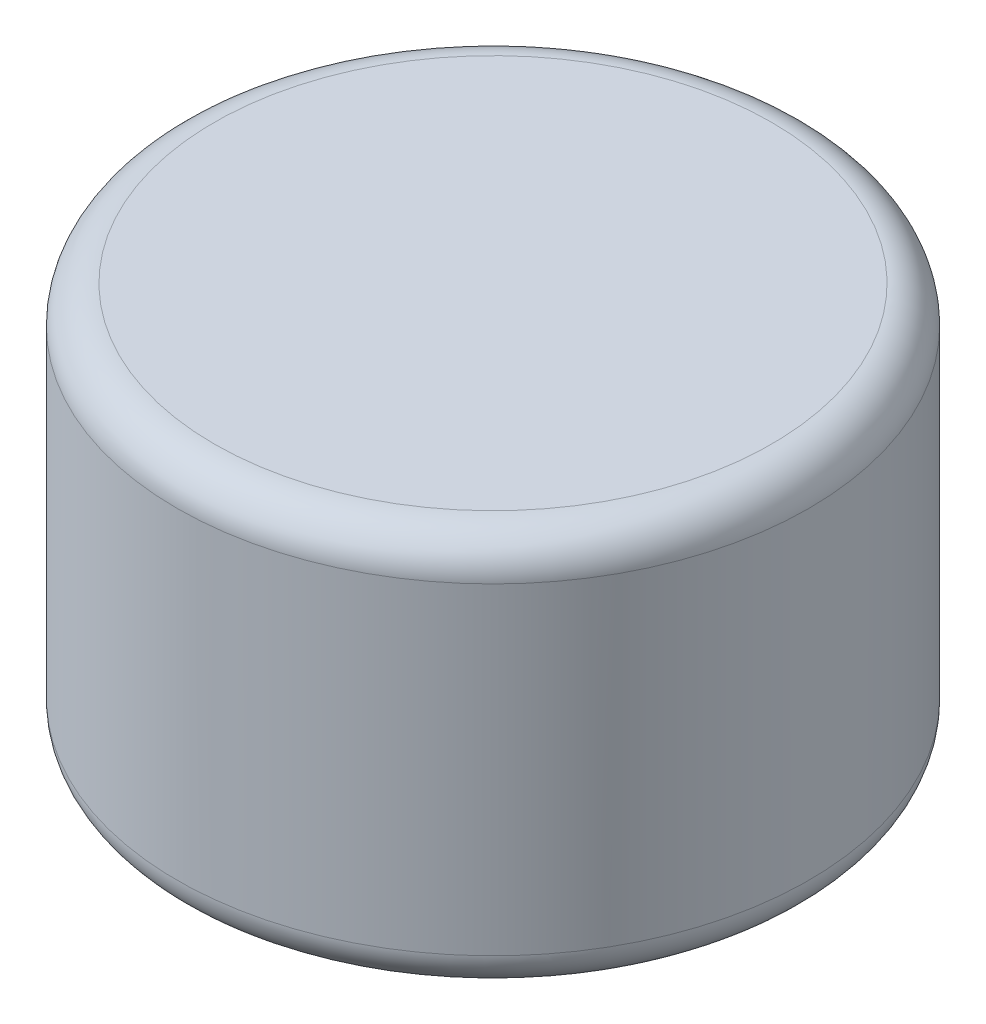
ISO-10303-21;
HEADER;
FILE_DESCRIPTION(('STEP AP214'),'2;1');
FILE_NAME('part.step','',(''),(''),'','','');
FILE_SCHEMA(('AUTOMOTIVE_DESIGN { 1 0 10303 214 1 1 1 1 }'));
ENDSEC;
DATA;
#1=APPLICATION_CONTEXT('core data for automotive mechanical design processes');
#2=APPLICATION_PROTOCOL_DEFINITION('international standard','automotive_design',2000,#1);
#3=PRODUCT_CONTEXT('',#1,'mechanical');
#4=PRODUCT('Part','Part','',(#3));
#5=PRODUCT_RELATED_PRODUCT_CATEGORY('part','',(#4));
#6=PRODUCT_DEFINITION_FORMATION('','',#4);
#7=PRODUCT_DEFINITION_CONTEXT('part definition',#1,'design');
#8=PRODUCT_DEFINITION('design','',#6,#7);
#9=PRODUCT_DEFINITION_SHAPE('','',#8);
#10=(LENGTH_UNIT() NAMED_UNIT(*) SI_UNIT(.MILLI.,.METRE.));
#11=(NAMED_UNIT(*) PLANE_ANGLE_UNIT() SI_UNIT($,.RADIAN.));
#12=(NAMED_UNIT(*) SI_UNIT($,.STERADIAN.) SOLID_ANGLE_UNIT());
#13=UNCERTAINTY_MEASURE_WITH_UNIT(LENGTH_MEASURE(1.E-05),#10,'distance_accuracy_value','');
#14=(GEOMETRIC_REPRESENTATION_CONTEXT(3) GLOBAL_UNCERTAINTY_ASSIGNED_CONTEXT((#13)) GLOBAL_UNIT_ASSIGNED_CONTEXT((#10,
#11,#12)) REPRESENTATION_CONTEXT('',''));
#15=CARTESIAN_POINT('',(0.,0.,0.));
#16=DIRECTION('',(0.,0.,1.));
#17=DIRECTION('',(1.,0.,0.));
#18=AXIS2_PLACEMENT_3D('',#15,#16,#17);
#19=CARTESIAN_POINT('',(0.,16.,0.));
#20=DIRECTION('',(0.,1.,0.));
#21=DIRECTION('',(0.,0.,1.));
#22=AXIS2_PLACEMENT_3D('',#19,#20,#21);
#23=PLANE('',#22);
#24=CARTESIAN_POINT('',(0.,16.,0.));
#25=DIRECTION('',(0.,1.,0.));
#26=DIRECTION('',(0.,0.,1.));
#27=AXIS2_PLACEMENT_3D('',#24,#25,#26);
#28=CIRCLE('',#27,11.25);
#29=CARTESIAN_POINT('',(0.,16.,11.25));
#30=VERTEX_POINT('',#29);
#31=EDGE_CURVE('E10',#30,#30,#28,.T.);
#32=ORIENTED_EDGE('',*,*,#31,.T.);
#33=EDGE_LOOP('',(#32));
#34=FACE_BOUND('',#33,.T.);
#35=ADVANCED_FACE('F36',(#34),#23,.T.);
#36=CARTESIAN_POINT('',(0.,0.,0.));
#37=DIRECTION('',(0.,-1.,0.));
#38=DIRECTION('',(0.,0.,-1.));
#39=AXIS2_PLACEMENT_3D('',#36,#37,#38);
#40=CYLINDRICAL_SURFACE('',#39,12.75);
#41=CARTESIAN_POINT('',(0.,1.5,0.));
#42=DIRECTION('',(0.,-1.,0.));
#43=DIRECTION('',(0.,0.,-1.));
#44=AXIS2_PLACEMENT_3D('',#41,#42,#43);
#45=CIRCLE('',#44,12.75);
#46=CARTESIAN_POINT('',(0.,1.5,-12.75));
#47=VERTEX_POINT('',#46);
#48=EDGE_CURVE('E46',#47,#47,#45,.F.);
#49=ORIENTED_EDGE('',*,*,#48,.T.);
#50=EDGE_LOOP('',(#49));
#51=FACE_BOUND('',#50,.T.);
#52=CARTESIAN_POINT('',(0.,14.5,0.));
#53=DIRECTION('',(0.,1.,0.));
#54=DIRECTION('',(0.,0.,1.));
#55=AXIS2_PLACEMENT_3D('',#52,#53,#54);
#56=CIRCLE('',#55,12.75);
#57=CARTESIAN_POINT('',(0.,14.5,12.75));
#58=VERTEX_POINT('',#57);
#59=EDGE_CURVE('E49',#58,#58,#56,.F.);
#60=ORIENTED_EDGE('',*,*,#59,.T.);
#61=EDGE_LOOP('',(#60));
#62=FACE_BOUND('',#61,.T.);
#63=ADVANCED_FACE('F93',(#51,#62),#40,.T.);
#64=CARTESIAN_POINT('',(0.,0.,0.));
#65=DIRECTION('',(0.,-1.,0.));
#66=DIRECTION('',(0.,0.,-1.));
#67=AXIS2_PLACEMENT_3D('',#64,#65,#66);
#68=PLANE('',#67);
#69=CARTESIAN_POINT('',(0.,0.,0.));
#70=DIRECTION('',(0.,-1.,0.));
#71=DIRECTION('',(0.,0.,-1.));
#72=AXIS2_PLACEMENT_3D('',#69,#70,#71);
#73=CIRCLE('',#72,11.25);
#74=CARTESIAN_POINT('',(0.,0.,-11.25));
#75=VERTEX_POINT('',#74);
#76=EDGE_CURVE('E53',#75,#75,#73,.T.);
#77=ORIENTED_EDGE('',*,*,#76,.T.);
#78=EDGE_LOOP('',(#77));
#79=FACE_BOUND('',#78,.T.);
#80=ADVANCED_FACE('F81',(#79),#68,.T.);
#81=CARTESIAN_POINT('',(0.,1.5,0.));
#82=DIRECTION('',(0.,-1.,0.));
#83=DIRECTION('',(0.,0.,-1.));
#84=AXIS2_PLACEMENT_3D('',#81,#82,#83);
#85=TOROIDAL_SURFACE('',#84,11.25,1.5);
#86=ORIENTED_EDGE('',*,*,#48,.F.);
#87=EDGE_LOOP('',(#86));
#88=FACE_BOUND('',#87,.T.);
#89=ORIENTED_EDGE('',*,*,#76,.F.);
#90=EDGE_LOOP('',(#89));
#91=FACE_BOUND('',#90,.T.);
#92=ADVANCED_FACE('F84',(#88,#91),#85,.T.);
#93=CARTESIAN_POINT('',(0.,14.5,0.));
#94=DIRECTION('',(0.,1.,0.));
#95=DIRECTION('',(0.,0.,1.));
#96=AXIS2_PLACEMENT_3D('',#93,#94,#95);
#97=TOROIDAL_SURFACE('',#96,11.25,1.5);
#98=ORIENTED_EDGE('',*,*,#31,.F.);
#99=EDGE_LOOP('',(#98));
#100=FACE_BOUND('',#99,.T.);
#101=ORIENTED_EDGE('',*,*,#59,.F.);
#102=EDGE_LOOP('',(#101));
#103=FACE_BOUND('',#102,.T.);
#104=ADVANCED_FACE('F37',(#100,#103),#97,.T.);
#105=CLOSED_SHELL('',(#35,#63,#80,#92,#104));
#106=CARTESIAN_POINT('',(0.,0.75,0.));
#107=DIRECTION('',(0.,1.,0.));
#108=DIRECTION('',(0.,0.,1.));
#109=AXIS2_PLACEMENT_3D('',#106,#107,#108);
#110=PLANE('',#109);
#111=CARTESIAN_POINT('',(0.,0.75,0.));
#112=DIRECTION('',(0.,-1.,0.));
#113=DIRECTION('',(0.,0.,-1.));
#114=AXIS2_PLACEMENT_3D('',#111,#112,#113);
#115=CIRCLE('',#114,12.);
#116=CARTESIAN_POINT('',(0.,0.75,-12.));
#117=VERTEX_POINT('',#116);
#118=EDGE_CURVE('E56',#117,#117,#115,.T.);
#119=ORIENTED_EDGE('',*,*,#118,.F.);
#120=EDGE_LOOP('',(#119));
#121=FACE_BOUND('',#120,.T.);
#122=ADVANCED_FACE('F68',(#121),#110,.T.);
#123=CARTESIAN_POINT('',(0.,0.,0.));
#124=DIRECTION('',(0.,-1.,0.));
#125=DIRECTION('',(0.,0.,-1.));
#126=AXIS2_PLACEMENT_3D('',#123,#124,#125);
#127=CYLINDRICAL_SURFACE('',#126,12.);
#128=ORIENTED_EDGE('',*,*,#118,.T.);
#129=EDGE_LOOP('',(#128));
#130=FACE_BOUND('',#129,.T.);
#131=CARTESIAN_POINT('',(0.,15.25,0.));
#132=DIRECTION('',(0.,-1.,0.));
#133=DIRECTION('',(0.,0.,-1.));
#134=AXIS2_PLACEMENT_3D('',#131,#132,#133);
#135=CIRCLE('',#134,12.);
#136=CARTESIAN_POINT('',(0.,15.25,-12.));
#137=VERTEX_POINT('',#136);
#138=EDGE_CURVE('E64',#137,#137,#135,.T.);
#139=ORIENTED_EDGE('',*,*,#138,.F.);
#140=EDGE_LOOP('',(#139));
#141=FACE_BOUND('',#140,.T.);
#142=ADVANCED_FACE('F70',(#130,#141),#127,.F.);
#143=CARTESIAN_POINT('',(0.,15.25,0.));
#144=DIRECTION('',(0.,-1.,0.));
#145=DIRECTION('',(0.,0.,-1.));
#146=AXIS2_PLACEMENT_3D('',#143,#144,#145);
#147=PLANE('',#146);
#148=ORIENTED_EDGE('',*,*,#138,.T.);
#149=EDGE_LOOP('',(#148));
#150=FACE_BOUND('',#149,.T.);
#151=ADVANCED_FACE('F67',(#150),#147,.T.);
#152=CLOSED_SHELL('',(#122,#142,#151));
#153=ORIENTED_CLOSED_SHELL('',*,#152,.T.);
#154=BREP_WITH_VOIDS('B2',#105,(#153));
#155=ADVANCED_BREP_SHAPE_REPRESENTATION('',(#18,#154),#14);
#156=SHAPE_DEFINITION_REPRESENTATION(#9,#155);
ENDSEC;
END-ISO-10303-21;
